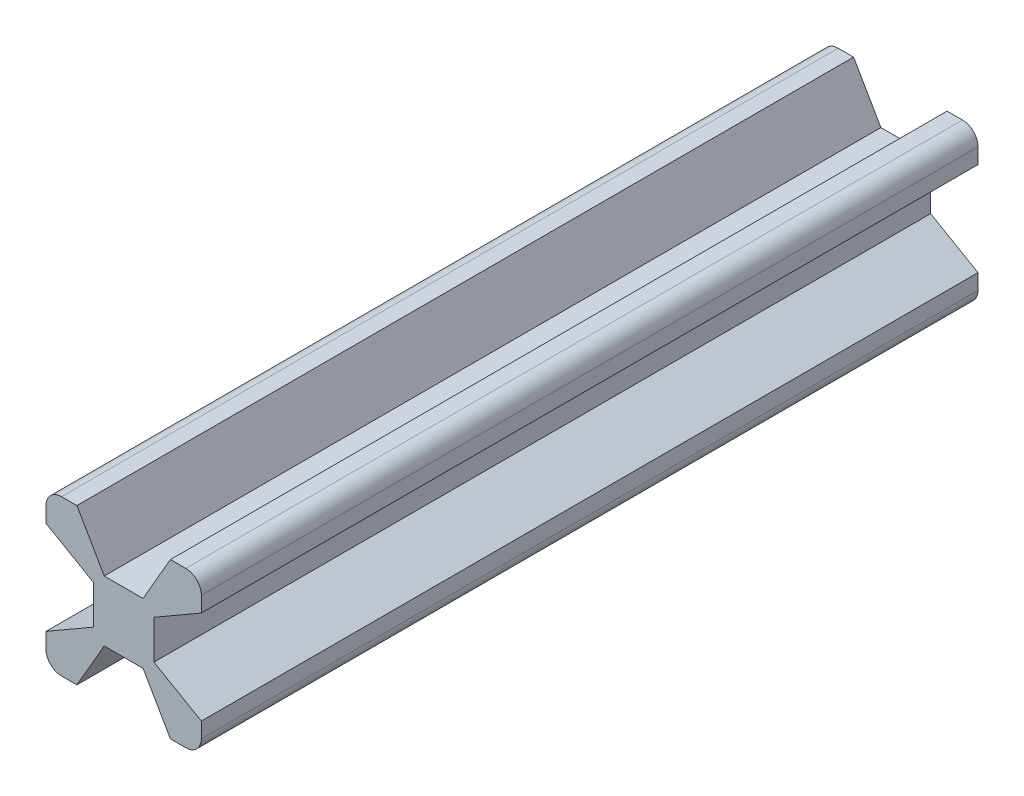
ISO-10303-21;
HEADER;
FILE_DESCRIPTION(('STEP AP214'),'2;1');
FILE_NAME('part.step','',(''),(''),'','','');
FILE_SCHEMA(('AUTOMOTIVE_DESIGN { 1 0 10303 214 1 1 1 1 }'));
ENDSEC;
DATA;
#1=APPLICATION_CONTEXT('core data for automotive mechanical design processes');
#2=APPLICATION_PROTOCOL_DEFINITION('international standard','automotive_design',2000,#1);
#3=PRODUCT_CONTEXT('',#1,'mechanical');
#4=PRODUCT('Part','Part','',(#3));
#5=PRODUCT_RELATED_PRODUCT_CATEGORY('part','',(#4));
#6=PRODUCT_DEFINITION_FORMATION('','',#4);
#7=PRODUCT_DEFINITION_CONTEXT('part definition',#1,'design');
#8=PRODUCT_DEFINITION('design','',#6,#7);
#9=PRODUCT_DEFINITION_SHAPE('','',#8);
#10=(LENGTH_UNIT() NAMED_UNIT(*) SI_UNIT(.MILLI.,.METRE.));
#11=(NAMED_UNIT(*) PLANE_ANGLE_UNIT() SI_UNIT($,.RADIAN.));
#12=(NAMED_UNIT(*) SI_UNIT($,.STERADIAN.) SOLID_ANGLE_UNIT());
#13=UNCERTAINTY_MEASURE_WITH_UNIT(LENGTH_MEASURE(1.E-05),#10,'distance_accuracy_value','');
#14=(GEOMETRIC_REPRESENTATION_CONTEXT(3) GLOBAL_UNCERTAINTY_ASSIGNED_CONTEXT((#13)) GLOBAL_UNIT_ASSIGNED_CONTEXT((#10,
#11,#12)) REPRESENTATION_CONTEXT('',''));
#15=CARTESIAN_POINT('',(0.,0.,0.));
#16=DIRECTION('',(0.,0.,1.));
#17=DIRECTION('',(1.,0.,0.));
#18=AXIS2_PLACEMENT_3D('',#15,#16,#17);
#19=CARTESIAN_POINT('',(-10.,-10.,100.));
#20=DIRECTION('',(1.,0.,0.));
#21=DIRECTION('',(0.,0.,-1.));
#22=AXIS2_PLACEMENT_3D('',#19,#20,#21);
#23=PLANE('',#22);
#24=DIRECTION('',(0.,-1.,0.));
#25=VECTOR('',#24,1.);
#26=CARTESIAN_POINT('',(-10.,-10.,100.));
#27=LINE('',#26,#25);
#28=CARTESIAN_POINT('',(-10.,8.,100.));
#29=VERTEX_POINT('',#28);
#30=CARTESIAN_POINT('',(-10.,6.02183664205666,100.));
#31=VERTEX_POINT('',#30);
#32=EDGE_CURVE('E318',#29,#31,#27,.T.);
#33=ORIENTED_EDGE('',*,*,#32,.F.);
#34=DIRECTION('',(0.,0.,-1.));
#35=VECTOR('',#34,1.);
#36=CARTESIAN_POINT('',(-10.,8.,100.));
#37=LINE('',#36,#35);
#38=CARTESIAN_POINT('',(-10.,8.,0.));
#39=VERTEX_POINT('',#38);
#40=EDGE_CURVE('E50',#29,#39,#37,.T.);
#41=ORIENTED_EDGE('',*,*,#40,.T.);
#42=DIRECTION('',(0.,-1.,0.));
#43=VECTOR('',#42,1.);
#44=CARTESIAN_POINT('',(-10.,-10.,0.));
#45=LINE('',#44,#43);
#46=CARTESIAN_POINT('',(-10.,6.02183664205666,0.));
#47=VERTEX_POINT('',#46);
#48=EDGE_CURVE('E330',#39,#47,#45,.T.);
#49=ORIENTED_EDGE('',*,*,#48,.T.);
#50=DIRECTION('',(0.,0.,-1.));
#51=VECTOR('',#50,1.);
#52=CARTESIAN_POINT('',(-10.,6.02183664205666,100.));
#53=LINE('',#52,#51);
#54=EDGE_CURVE('E290',#31,#47,#53,.T.);
#55=ORIENTED_EDGE('',*,*,#54,.F.);
#56=EDGE_LOOP('',(#33,#41,#49,#55));
#57=FACE_BOUND('',#56,.T.);
#58=ADVANCED_FACE('F39',(#57),#23,.F.);
#59=CARTESIAN_POINT('',(10.,-10.,100.));
#60=DIRECTION('',(0.,1.,0.));
#61=DIRECTION('',(-1.,0.,0.));
#62=AXIS2_PLACEMENT_3D('',#59,#60,#61);
#63=PLANE('',#62);
#64=DIRECTION('',(1.,0.,0.));
#65=VECTOR('',#64,1.);
#66=CARTESIAN_POINT('',(10.,-10.,100.));
#67=LINE('',#66,#65);
#68=CARTESIAN_POINT('',(-8.,-10.,100.));
#69=VERTEX_POINT('',#68);
#70=CARTESIAN_POINT('',(-6.0218366420567,-10.,100.));
#71=VERTEX_POINT('',#70);
#72=EDGE_CURVE('E325',#69,#71,#67,.T.);
#73=ORIENTED_EDGE('',*,*,#72,.F.);
#74=DIRECTION('',(0.,0.,-1.));
#75=VECTOR('',#74,1.);
#76=CARTESIAN_POINT('',(-8.,-10.,100.));
#77=LINE('',#76,#75);
#78=CARTESIAN_POINT('',(-8.,-10.,0.));
#79=VERTEX_POINT('',#78);
#80=EDGE_CURVE('E326',#69,#79,#77,.T.);
#81=ORIENTED_EDGE('',*,*,#80,.T.);
#82=DIRECTION('',(1.,0.,0.));
#83=VECTOR('',#82,1.);
#84=CARTESIAN_POINT('',(10.,-10.,0.));
#85=LINE('',#84,#83);
#86=CARTESIAN_POINT('',(-6.0218366420567,-10.,0.));
#87=VERTEX_POINT('',#86);
#88=EDGE_CURVE('E329',#79,#87,#85,.T.);
#89=ORIENTED_EDGE('',*,*,#88,.T.);
#90=DIRECTION('',(0.,0.,-1.));
#91=VECTOR('',#90,1.);
#92=CARTESIAN_POINT('',(-6.0218366420567,-10.,100.));
#93=LINE('',#92,#91);
#94=EDGE_CURVE('E257',#71,#87,#93,.T.);
#95=ORIENTED_EDGE('',*,*,#94,.F.);
#96=EDGE_LOOP('',(#73,#81,#89,#95));
#97=FACE_BOUND('',#96,.T.);
#98=ADVANCED_FACE('F399',(#97),#63,.F.);
#99=CARTESIAN_POINT('',(10.,-10.,100.));
#100=DIRECTION('',(-1.,0.,0.));
#101=DIRECTION('',(0.,0.,1.));
#102=AXIS2_PLACEMENT_3D('',#99,#100,#101);
#103=PLANE('',#102);
#104=DIRECTION('',(0.,1.,0.));
#105=VECTOR('',#104,1.);
#106=CARTESIAN_POINT('',(10.,-10.,100.));
#107=LINE('',#106,#105);
#108=CARTESIAN_POINT('',(10.,-8.,100.));
#109=VERTEX_POINT('',#108);
#110=CARTESIAN_POINT('',(10.0000000000001,-6.02183664205659,100.));
#111=VERTEX_POINT('',#110);
#112=EDGE_CURVE('E200',#109,#111,#107,.T.);
#113=ORIENTED_EDGE('',*,*,#112,.F.);
#114=DIRECTION('',(0.,0.,-1.));
#115=VECTOR('',#114,1.);
#116=CARTESIAN_POINT('',(10.,-8.,100.));
#117=LINE('',#116,#115);
#118=CARTESIAN_POINT('',(10.,-8.,0.));
#119=VERTEX_POINT('',#118);
#120=EDGE_CURVE('E354',#109,#119,#117,.T.);
#121=ORIENTED_EDGE('',*,*,#120,.T.);
#122=DIRECTION('',(0.,1.,0.));
#123=VECTOR('',#122,1.);
#124=CARTESIAN_POINT('',(10.,-10.,0.));
#125=LINE('',#124,#123);
#126=CARTESIAN_POINT('',(10.0000000000001,-6.02183664205659,0.));
#127=VERTEX_POINT('',#126);
#128=EDGE_CURVE('E227',#119,#127,#125,.T.);
#129=ORIENTED_EDGE('',*,*,#128,.T.);
#130=DIRECTION('',(0.,0.,-1.));
#131=VECTOR('',#130,1.);
#132=CARTESIAN_POINT('',(10.0000000000001,-6.02183664205659,100.));
#133=LINE('',#132,#131);
#134=EDGE_CURVE('E218',#111,#127,#133,.T.);
#135=ORIENTED_EDGE('',*,*,#134,.F.);
#136=EDGE_LOOP('',(#113,#121,#129,#135));
#137=FACE_BOUND('',#136,.T.);
#138=ADVANCED_FACE('F226',(#137),#103,.F.);
#139=CARTESIAN_POINT('',(10.,10.,100.));
#140=DIRECTION('',(0.,-1.,0.));
#141=DIRECTION('',(1.,0.,0.));
#142=AXIS2_PLACEMENT_3D('',#139,#140,#141);
#143=PLANE('',#142);
#144=DIRECTION('',(-1.,0.,0.));
#145=VECTOR('',#144,1.);
#146=CARTESIAN_POINT('',(10.,10.,100.));
#147=LINE('',#146,#145);
#148=CARTESIAN_POINT('',(8.,10.,100.));
#149=VERTEX_POINT('',#148);
#150=CARTESIAN_POINT('',(6.0218366420567,10.,100.));
#151=VERTEX_POINT('',#150);
#152=EDGE_CURVE('E322',#149,#151,#147,.T.);
#153=ORIENTED_EDGE('',*,*,#152,.F.);
#154=DIRECTION('',(0.,0.,-1.));
#155=VECTOR('',#154,1.);
#156=CARTESIAN_POINT('',(8.,10.,100.));
#157=LINE('',#156,#155);
#158=CARTESIAN_POINT('',(8.,10.,0.));
#159=VERTEX_POINT('',#158);
#160=EDGE_CURVE('E356',#149,#159,#157,.T.);
#161=ORIENTED_EDGE('',*,*,#160,.T.);
#162=DIRECTION('',(-1.,0.,0.));
#163=VECTOR('',#162,1.);
#164=CARTESIAN_POINT('',(10.,10.,0.));
#165=LINE('',#164,#163);
#166=CARTESIAN_POINT('',(6.0218366420567,10.,0.));
#167=VERTEX_POINT('',#166);
#168=EDGE_CURVE('E333',#159,#167,#165,.T.);
#169=ORIENTED_EDGE('',*,*,#168,.T.);
#170=DIRECTION('',(0.,0.,-1.));
#171=VECTOR('',#170,1.);
#172=CARTESIAN_POINT('',(6.0218366420567,10.,100.));
#173=LINE('',#172,#171);
#174=EDGE_CURVE('E314',#151,#167,#173,.T.);
#175=ORIENTED_EDGE('',*,*,#174,.F.);
#176=EDGE_LOOP('',(#153,#161,#169,#175));
#177=FACE_BOUND('',#176,.T.);
#178=ADVANCED_FACE('F452',(#177),#143,.F.);
#179=CARTESIAN_POINT('',(-9.99999999999998,-6.02183664205673,0.));
#180=VERTEX_POINT('',#179);
#181=CARTESIAN_POINT('',(-10.,-8.,0.));
#182=VERTEX_POINT('',#181);
#183=EDGE_CURVE('E320',#180,#182,#45,.T.);
#184=ORIENTED_EDGE('',*,*,#183,.T.);
#185=DIRECTION('',(0.,0.,-1.));
#186=VECTOR('',#185,1.);
#187=CARTESIAN_POINT('',(-10.,-8.,100.));
#188=LINE('',#187,#186);
#189=CARTESIAN_POINT('',(-10.,-8.,100.));
#190=VERTEX_POINT('',#189);
#191=EDGE_CURVE('E350',#182,#190,#188,.F.);
#192=ORIENTED_EDGE('',*,*,#191,.T.);
#193=CARTESIAN_POINT('',(-9.99999999999998,-6.02183664205673,100.));
#194=VERTEX_POINT('',#193);
#195=EDGE_CURVE('E321',#194,#190,#27,.T.);
#196=ORIENTED_EDGE('',*,*,#195,.F.);
#197=DIRECTION('',(0.,0.,-1.));
#198=VECTOR('',#197,1.);
#199=CARTESIAN_POINT('',(-9.99999999999998,-6.02183664205673,100.));
#200=LINE('',#199,#198);
#201=EDGE_CURVE('E283',#194,#180,#200,.T.);
#202=ORIENTED_EDGE('',*,*,#201,.T.);
#203=EDGE_LOOP('',(#184,#192,#196,#202));
#204=FACE_BOUND('',#203,.T.);
#205=ADVANCED_FACE('F389',(#204),#23,.F.);
#206=CARTESIAN_POINT('',(6.0218366420567,-10.,0.));
#207=VERTEX_POINT('',#206);
#208=CARTESIAN_POINT('',(8.,-10.,0.));
#209=VERTEX_POINT('',#208);
#210=EDGE_CURVE('E328',#207,#209,#85,.T.);
#211=ORIENTED_EDGE('',*,*,#210,.T.);
#212=DIRECTION('',(0.,0.,-1.));
#213=VECTOR('',#212,1.);
#214=CARTESIAN_POINT('',(8.,-10.,100.));
#215=LINE('',#214,#213);
#216=CARTESIAN_POINT('',(8.,-10.,100.));
#217=VERTEX_POINT('',#216);
#218=EDGE_CURVE('E360',#209,#217,#215,.F.);
#219=ORIENTED_EDGE('',*,*,#218,.T.);
#220=CARTESIAN_POINT('',(6.0218366420567,-10.,100.));
#221=VERTEX_POINT('',#220);
#222=EDGE_CURVE('E319',#221,#217,#67,.T.);
#223=ORIENTED_EDGE('',*,*,#222,.F.);
#224=DIRECTION('',(0.,0.,-1.));
#225=VECTOR('',#224,1.);
#226=CARTESIAN_POINT('',(6.0218366420567,-10.,100.));
#227=LINE('',#226,#225);
#228=EDGE_CURVE('E260',#221,#207,#227,.T.);
#229=ORIENTED_EDGE('',*,*,#228,.T.);
#230=EDGE_LOOP('',(#211,#219,#223,#229));
#231=FACE_BOUND('',#230,.T.);
#232=ADVANCED_FACE('F414',(#231),#63,.F.);
#233=CARTESIAN_POINT('',(9.99999999999994,6.0218366420568,0.));
#234=VERTEX_POINT('',#233);
#235=CARTESIAN_POINT('',(10.,8.,0.));
#236=VERTEX_POINT('',#235);
#237=EDGE_CURVE('E335',#234,#236,#125,.T.);
#238=ORIENTED_EDGE('',*,*,#237,.T.);
#239=DIRECTION('',(0.,0.,-1.));
#240=VECTOR('',#239,1.);
#241=CARTESIAN_POINT('',(10.,8.,100.));
#242=LINE('',#241,#240);
#243=CARTESIAN_POINT('',(10.,8.,100.));
#244=VERTEX_POINT('',#243);
#245=EDGE_CURVE('E362',#236,#244,#242,.F.);
#246=ORIENTED_EDGE('',*,*,#245,.T.);
#247=CARTESIAN_POINT('',(9.99999999999994,6.0218366420568,100.));
#248=VERTEX_POINT('',#247);
#249=EDGE_CURVE('E213',#248,#244,#107,.T.);
#250=ORIENTED_EDGE('',*,*,#249,.F.);
#251=DIRECTION('',(0.,0.,-1.));
#252=VECTOR('',#251,1.);
#253=CARTESIAN_POINT('',(9.99999999999994,6.0218366420568,100.));
#254=LINE('',#253,#252);
#255=EDGE_CURVE('E229',#248,#234,#254,.T.);
#256=ORIENTED_EDGE('',*,*,#255,.T.);
#257=EDGE_LOOP('',(#238,#246,#250,#256));
#258=FACE_BOUND('',#257,.T.);
#259=ADVANCED_FACE('F439',(#258),#103,.F.);
#260=CARTESIAN_POINT('',(-6.0218366420567,10.,0.));
#261=VERTEX_POINT('',#260);
#262=CARTESIAN_POINT('',(-8.,10.,0.));
#263=VERTEX_POINT('',#262);
#264=EDGE_CURVE('E331',#261,#263,#165,.T.);
#265=ORIENTED_EDGE('',*,*,#264,.T.);
#266=DIRECTION('',(0.,0.,-1.));
#267=VECTOR('',#266,1.);
#268=CARTESIAN_POINT('',(-8.,10.,100.));
#269=LINE('',#268,#267);
#270=CARTESIAN_POINT('',(-8.,10.,100.));
#271=VERTEX_POINT('',#270);
#272=EDGE_CURVE('E11',#263,#271,#269,.F.);
#273=ORIENTED_EDGE('',*,*,#272,.T.);
#274=CARTESIAN_POINT('',(-6.0218366420567,10.,100.));
#275=VERTEX_POINT('',#274);
#276=EDGE_CURVE('E215',#275,#271,#147,.T.);
#277=ORIENTED_EDGE('',*,*,#276,.F.);
#278=DIRECTION('',(0.,0.,-1.));
#279=VECTOR('',#278,1.);
#280=CARTESIAN_POINT('',(-6.0218366420567,10.,100.));
#281=LINE('',#280,#279);
#282=EDGE_CURVE('E313',#275,#261,#281,.T.);
#283=ORIENTED_EDGE('',*,*,#282,.T.);
#284=EDGE_LOOP('',(#265,#273,#277,#283));
#285=FACE_BOUND('',#284,.T.);
#286=ADVANCED_FACE('F465',(#285),#143,.F.);
#287=CARTESIAN_POINT('',(0.,0.,100.));
#288=DIRECTION('',(0.,0.,1.));
#289=DIRECTION('',(1.,0.,0.));
#290=AXIS2_PLACEMENT_3D('',#287,#288,#289);
#291=PLANE('',#290);
#292=ORIENTED_EDGE('',*,*,#195,.T.);
#293=CARTESIAN_POINT('',(-8.,-8.,100.));
#294=DIRECTION('',(0.,0.,1.));
#295=DIRECTION('',(1.,0.,0.));
#296=AXIS2_PLACEMENT_3D('',#293,#294,#295);
#297=CIRCLE('',#296,2.);
#298=EDGE_CURVE('E352',#190,#69,#297,.T.);
#299=ORIENTED_EDGE('',*,*,#298,.T.);
#300=ORIENTED_EDGE('',*,*,#72,.T.);
#301=DIRECTION('',(-0.499999999999998,-0.86602540378444,0.));
#302=VECTOR('',#301,1.);
#303=CARTESIAN_POINT('',(-0.186250462620355,0.107531754730554,100.));
#304=LINE('',#303,#302);
#305=CARTESIAN_POINT('',(-2.5,-3.9,100.));
#306=VERTEX_POINT('',#305);
#307=EDGE_CURVE('E238',#306,#71,#304,.T.);
#308=ORIENTED_EDGE('',*,*,#307,.F.);
#309=DIRECTION('',(-1.,0.,0.));
#310=VECTOR('',#309,1.);
#311=CARTESIAN_POINT('',(0.,-3.9,100.));
#312=LINE('',#311,#310);
#313=CARTESIAN_POINT('',(2.5,-3.9,100.));
#314=VERTEX_POINT('',#313);
#315=EDGE_CURVE('E247',#314,#306,#312,.T.);
#316=ORIENTED_EDGE('',*,*,#315,.F.);
#317=DIRECTION('',(-0.499999999999998,0.86602540378444,0.));
#318=VECTOR('',#317,1.);
#319=CARTESIAN_POINT('',(0.186250462620354,0.107531754730553,100.));
#320=LINE('',#319,#318);
#321=EDGE_CURVE('E242',#221,#314,#320,.T.);
#322=ORIENTED_EDGE('',*,*,#321,.F.);
#323=ORIENTED_EDGE('',*,*,#222,.T.);
#324=CARTESIAN_POINT('',(8.,-8.,100.));
#325=DIRECTION('',(0.,0.,1.));
#326=DIRECTION('',(1.,0.,0.));
#327=AXIS2_PLACEMENT_3D('',#324,#325,#326);
#328=CIRCLE('',#327,2.);
#329=EDGE_CURVE('E210',#217,#109,#328,.T.);
#330=ORIENTED_EDGE('',*,*,#329,.T.);
#331=ORIENTED_EDGE('',*,*,#112,.T.);
#332=DIRECTION('',(0.866025403784445,-0.499999999999989,0.));
#333=VECTOR('',#332,1.);
#334=CARTESIAN_POINT('',(-0.107531754730552,-0.186250462620356,100.));
#335=LINE('',#334,#333);
#336=CARTESIAN_POINT('',(3.90000000000002,-2.49999999999996,100.));
#337=VERTEX_POINT('',#336);
#338=EDGE_CURVE('E204',#337,#111,#335,.T.);
#339=ORIENTED_EDGE('',*,*,#338,.F.);
#340=DIRECTION('',(0.,-1.,0.));
#341=VECTOR('',#340,1.);
#342=CARTESIAN_POINT('',(3.9,0.,100.));
#343=LINE('',#342,#341);
#344=CARTESIAN_POINT('',(3.89999999999997,2.50000000000004,100.));
#345=VERTEX_POINT('',#344);
#346=EDGE_CURVE('E422',#345,#337,#343,.T.);
#347=ORIENTED_EDGE('',*,*,#346,.F.);
#348=DIRECTION('',(-0.866025403784435,-0.500000000000007,0.));
#349=VECTOR('',#348,1.);
#350=CARTESIAN_POINT('',(-0.107531754730555,0.186250462620353,100.));
#351=LINE('',#350,#349);
#352=EDGE_CURVE('E224',#248,#345,#351,.T.);
#353=ORIENTED_EDGE('',*,*,#352,.F.);
#354=ORIENTED_EDGE('',*,*,#249,.T.);
#355=CARTESIAN_POINT('',(8.,8.,100.));
#356=DIRECTION('',(0.,0.,1.));
#357=DIRECTION('',(1.,0.,0.));
#358=AXIS2_PLACEMENT_3D('',#355,#356,#357);
#359=CIRCLE('',#358,2.);
#360=EDGE_CURVE('E348',#244,#149,#359,.T.);
#361=ORIENTED_EDGE('',*,*,#360,.T.);
#362=ORIENTED_EDGE('',*,*,#152,.T.);
#363=DIRECTION('',(0.499999999999998,0.86602540378444,0.));
#364=VECTOR('',#363,1.);
#365=CARTESIAN_POINT('',(0.186250462620355,-0.107531754730554,100.));
#366=LINE('',#365,#364);
#367=CARTESIAN_POINT('',(2.5,3.9,100.));
#368=VERTEX_POINT('',#367);
#369=EDGE_CURVE('E292',#368,#151,#366,.T.);
#370=ORIENTED_EDGE('',*,*,#369,.F.);
#371=DIRECTION('',(1.,0.,0.));
#372=VECTOR('',#371,1.);
#373=CARTESIAN_POINT('',(0.,3.9,100.));
#374=LINE('',#373,#372);
#375=CARTESIAN_POINT('',(-2.5,3.9,100.));
#376=VERTEX_POINT('',#375);
#377=EDGE_CURVE('E300',#376,#368,#374,.T.);
#378=ORIENTED_EDGE('',*,*,#377,.F.);
#379=DIRECTION('',(0.499999999999998,-0.86602540378444,0.));
#380=VECTOR('',#379,1.);
#381=CARTESIAN_POINT('',(-0.186250462620354,-0.107531754730553,100.));
#382=LINE('',#381,#380);
#383=EDGE_CURVE('E294',#275,#376,#382,.T.);
#384=ORIENTED_EDGE('',*,*,#383,.F.);
#385=ORIENTED_EDGE('',*,*,#276,.T.);
#386=CARTESIAN_POINT('',(-8.,8.,100.));
#387=DIRECTION('',(0.,0.,1.));
#388=DIRECTION('',(1.,0.,0.));
#389=AXIS2_PLACEMENT_3D('',#386,#387,#388);
#390=CIRCLE('',#389,2.);
#391=EDGE_CURVE('E53',#271,#29,#390,.T.);
#392=ORIENTED_EDGE('',*,*,#391,.T.);
#393=ORIENTED_EDGE('',*,*,#32,.T.);
#394=DIRECTION('',(-0.866025403784442,0.499999999999995,0.));
#395=VECTOR('',#394,1.);
#396=CARTESIAN_POINT('',(0.107531754730553,0.186250462620355,100.));
#397=LINE('',#396,#395);
#398=CARTESIAN_POINT('',(-3.90000000000001,2.49999999999999,100.));
#399=VERTEX_POINT('',#398);
#400=EDGE_CURVE('E262',#399,#31,#397,.T.);
#401=ORIENTED_EDGE('',*,*,#400,.F.);
#402=DIRECTION('',(0.,1.,0.));
#403=VECTOR('',#402,1.);
#404=CARTESIAN_POINT('',(-3.9,0.,100.));
#405=LINE('',#404,#403);
#406=CARTESIAN_POINT('',(-3.89999999999999,-2.50000000000001,100.));
#407=VERTEX_POINT('',#406);
#408=EDGE_CURVE('E269',#407,#399,#405,.T.);
#409=ORIENTED_EDGE('',*,*,#408,.F.);
#410=DIRECTION('',(0.866025403784438,0.500000000000001,0.));
#411=VECTOR('',#410,1.);
#412=CARTESIAN_POINT('',(0.107531754730554,-0.186250462620354,100.));
#413=LINE('',#412,#411);
#414=EDGE_CURVE('E270',#194,#407,#413,.T.);
#415=ORIENTED_EDGE('',*,*,#414,.F.);
#416=EDGE_LOOP('',(#292,#299,#300,#308,#316,#322,#323,#330,#331,#339,#347,#353,#354,#361,#362,
#370,#378,#384,#385,#392,#393,#401,#409,#415));
#417=FACE_BOUND('',#416,.T.);
#418=ADVANCED_FACE('F205',(#417),#291,.T.);
#419=CARTESIAN_POINT('',(0.,0.,0.));
#420=DIRECTION('',(0.,0.,1.));
#421=DIRECTION('',(1.,0.,0.));
#422=AXIS2_PLACEMENT_3D('',#419,#420,#421);
#423=PLANE('',#422);
#424=ORIENTED_EDGE('',*,*,#88,.F.);
#425=CARTESIAN_POINT('',(-8.,-8.,0.));
#426=DIRECTION('',(0.,0.,1.));
#427=DIRECTION('',(1.,0.,0.));
#428=AXIS2_PLACEMENT_3D('',#425,#426,#427);
#429=CIRCLE('',#428,2.);
#430=EDGE_CURVE('E343',#79,#182,#429,.F.);
#431=ORIENTED_EDGE('',*,*,#430,.T.);
#432=ORIENTED_EDGE('',*,*,#183,.F.);
#433=DIRECTION('',(0.866025403784438,0.500000000000001,0.));
#434=VECTOR('',#433,1.);
#435=CARTESIAN_POINT('',(0.107531754730554,-0.186250462620354,0.));
#436=LINE('',#435,#434);
#437=CARTESIAN_POINT('',(-3.89999999999999,-2.50000000000001,0.));
#438=VERTEX_POINT('',#437);
#439=EDGE_CURVE('E274',#180,#438,#436,.T.);
#440=ORIENTED_EDGE('',*,*,#439,.T.);
#441=DIRECTION('',(0.,1.,0.));
#442=VECTOR('',#441,1.);
#443=CARTESIAN_POINT('',(-3.9,0.,0.));
#444=LINE('',#443,#442);
#445=CARTESIAN_POINT('',(-3.90000000000001,2.49999999999999,0.));
#446=VERTEX_POINT('',#445);
#447=EDGE_CURVE('E268',#438,#446,#444,.T.);
#448=ORIENTED_EDGE('',*,*,#447,.T.);
#449=DIRECTION('',(-0.866025403784442,0.499999999999995,0.));
#450=VECTOR('',#449,1.);
#451=CARTESIAN_POINT('',(0.107531754730553,0.186250462620355,0.));
#452=LINE('',#451,#450);
#453=EDGE_CURVE('E263',#446,#47,#452,.T.);
#454=ORIENTED_EDGE('',*,*,#453,.T.);
#455=ORIENTED_EDGE('',*,*,#48,.F.);
#456=CARTESIAN_POINT('',(-8.,8.,0.));
#457=DIRECTION('',(0.,0.,1.));
#458=DIRECTION('',(1.,0.,0.));
#459=AXIS2_PLACEMENT_3D('',#456,#457,#458);
#460=CIRCLE('',#459,2.);
#461=EDGE_CURVE('E338',#39,#263,#460,.F.);
#462=ORIENTED_EDGE('',*,*,#461,.T.);
#463=ORIENTED_EDGE('',*,*,#264,.F.);
#464=DIRECTION('',(0.499999999999998,-0.86602540378444,0.));
#465=VECTOR('',#464,1.);
#466=CARTESIAN_POINT('',(-0.186250462620354,-0.107531754730553,0.));
#467=LINE('',#466,#465);
#468=CARTESIAN_POINT('',(-2.5,3.9,0.));
#469=VERTEX_POINT('',#468);
#470=EDGE_CURVE('E305',#261,#469,#467,.T.);
#471=ORIENTED_EDGE('',*,*,#470,.T.);
#472=DIRECTION('',(1.,0.,0.));
#473=VECTOR('',#472,1.);
#474=CARTESIAN_POINT('',(0.,3.9,0.));
#475=LINE('',#474,#473);
#476=CARTESIAN_POINT('',(2.5,3.9,0.));
#477=VERTEX_POINT('',#476);
#478=EDGE_CURVE('E293',#469,#477,#475,.T.);
#479=ORIENTED_EDGE('',*,*,#478,.T.);
#480=DIRECTION('',(0.499999999999998,0.86602540378444,0.));
#481=VECTOR('',#480,1.);
#482=CARTESIAN_POINT('',(0.186250462620355,-0.107531754730554,0.));
#483=LINE('',#482,#481);
#484=EDGE_CURVE('E288',#477,#167,#483,.T.);
#485=ORIENTED_EDGE('',*,*,#484,.T.);
#486=ORIENTED_EDGE('',*,*,#168,.F.);
#487=CARTESIAN_POINT('',(8.,8.,0.));
#488=DIRECTION('',(0.,0.,1.));
#489=DIRECTION('',(1.,0.,0.));
#490=AXIS2_PLACEMENT_3D('',#487,#488,#489);
#491=CIRCLE('',#490,2.);
#492=EDGE_CURVE('E342',#159,#236,#491,.F.);
#493=ORIENTED_EDGE('',*,*,#492,.T.);
#494=ORIENTED_EDGE('',*,*,#237,.F.);
#495=DIRECTION('',(-0.866025403784435,-0.500000000000007,0.));
#496=VECTOR('',#495,1.);
#497=CARTESIAN_POINT('',(-0.107531754730555,0.186250462620353,0.));
#498=LINE('',#497,#496);
#499=CARTESIAN_POINT('',(3.89999999999997,2.50000000000004,0.));
#500=VERTEX_POINT('',#499);
#501=EDGE_CURVE('E423',#234,#500,#498,.T.);
#502=ORIENTED_EDGE('',*,*,#501,.T.);
#503=DIRECTION('',(0.,-1.,0.));
#504=VECTOR('',#503,1.);
#505=CARTESIAN_POINT('',(3.9,0.,0.));
#506=LINE('',#505,#504);
#507=CARTESIAN_POINT('',(3.90000000000002,-2.49999999999996,0.));
#508=VERTEX_POINT('',#507);
#509=EDGE_CURVE('E221',#500,#508,#506,.T.);
#510=ORIENTED_EDGE('',*,*,#509,.T.);
#511=DIRECTION('',(0.866025403784445,-0.499999999999989,0.));
#512=VECTOR('',#511,1.);
#513=CARTESIAN_POINT('',(-0.107531754730552,-0.186250462620356,0.));
#514=LINE('',#513,#512);
#515=EDGE_CURVE('E416',#508,#127,#514,.T.);
#516=ORIENTED_EDGE('',*,*,#515,.T.);
#517=ORIENTED_EDGE('',*,*,#128,.F.);
#518=CARTESIAN_POINT('',(8.,-8.,0.));
#519=DIRECTION('',(0.,0.,1.));
#520=DIRECTION('',(1.,0.,0.));
#521=AXIS2_PLACEMENT_3D('',#518,#519,#520);
#522=CIRCLE('',#521,2.);
#523=EDGE_CURVE('E344',#119,#209,#522,.F.);
#524=ORIENTED_EDGE('',*,*,#523,.T.);
#525=ORIENTED_EDGE('',*,*,#210,.F.);
#526=DIRECTION('',(-0.499999999999998,0.86602540378444,0.));
#527=VECTOR('',#526,1.);
#528=CARTESIAN_POINT('',(0.186250462620354,0.107531754730553,0.));
#529=LINE('',#528,#527);
#530=CARTESIAN_POINT('',(2.5,-3.9,0.));
#531=VERTEX_POINT('',#530);
#532=EDGE_CURVE('E234',#207,#531,#529,.T.);
#533=ORIENTED_EDGE('',*,*,#532,.T.);
#534=DIRECTION('',(-1.,0.,0.));
#535=VECTOR('',#534,1.);
#536=CARTESIAN_POINT('',(0.,-3.9,0.));
#537=LINE('',#536,#535);
#538=CARTESIAN_POINT('',(-2.5,-3.9,0.));
#539=VERTEX_POINT('',#538);
#540=EDGE_CURVE('E243',#531,#539,#537,.T.);
#541=ORIENTED_EDGE('',*,*,#540,.T.);
#542=DIRECTION('',(-0.499999999999998,-0.86602540378444,0.));
#543=VECTOR('',#542,1.);
#544=CARTESIAN_POINT('',(-0.186250462620355,0.107531754730554,0.));
#545=LINE('',#544,#543);
#546=EDGE_CURVE('E228',#539,#87,#545,.T.);
#547=ORIENTED_EDGE('',*,*,#546,.T.);
#548=EDGE_LOOP('',(#424,#431,#432,#440,#448,#454,#455,#462,#463,#471,#479,#485,#486,#493,#494,
#502,#510,#516,#517,#524,#525,#533,#541,#547));
#549=FACE_BOUND('',#548,.T.);
#550=ADVANCED_FACE('F371',(#549),#423,.F.);
#551=CARTESIAN_POINT('',(0.186250462620355,-0.107531754730554,100.));
#552=DIRECTION('',(-0.86602540378444,0.499999999999998,0.));
#553=DIRECTION('',(-0.499999999999998,-0.86602540378444,0.));
#554=AXIS2_PLACEMENT_3D('',#551,#552,#553);
#555=PLANE('',#554);
#556=ORIENTED_EDGE('',*,*,#484,.F.);
#557=DIRECTION('',(0.,0.,-1.));
#558=VECTOR('',#557,1.);
#559=CARTESIAN_POINT('',(2.5,3.9,100.));
#560=LINE('',#559,#558);
#561=EDGE_CURVE('E298',#368,#477,#560,.T.);
#562=ORIENTED_EDGE('',*,*,#561,.F.);
#563=ORIENTED_EDGE('',*,*,#369,.T.);
#564=ORIENTED_EDGE('',*,*,#174,.T.);
#565=EDGE_LOOP('',(#556,#562,#563,#564));
#566=FACE_BOUND('',#565,.T.);
#567=ADVANCED_FACE('F454',(#566),#555,.T.);
#568=CARTESIAN_POINT('',(-0.186250462620354,-0.107531754730553,100.));
#569=DIRECTION('',(0.86602540378444,0.499999999999998,0.));
#570=DIRECTION('',(-0.499999999999998,0.86602540378444,0.));
#571=AXIS2_PLACEMENT_3D('',#568,#569,#570);
#572=PLANE('',#571);
#573=ORIENTED_EDGE('',*,*,#470,.F.);
#574=ORIENTED_EDGE('',*,*,#282,.F.);
#575=ORIENTED_EDGE('',*,*,#383,.T.);
#576=DIRECTION('',(0.,0.,-1.));
#577=VECTOR('',#576,1.);
#578=CARTESIAN_POINT('',(-2.5,3.9,100.));
#579=LINE('',#578,#577);
#580=EDGE_CURVE('E310',#376,#469,#579,.T.);
#581=ORIENTED_EDGE('',*,*,#580,.T.);
#582=EDGE_LOOP('',(#573,#574,#575,#581));
#583=FACE_BOUND('',#582,.T.);
#584=ADVANCED_FACE('F462',(#583),#572,.T.);
#585=CARTESIAN_POINT('',(0.,3.9,100.));
#586=DIRECTION('',(0.,1.,0.));
#587=DIRECTION('',(0.,0.,1.));
#588=AXIS2_PLACEMENT_3D('',#585,#586,#587);
#589=PLANE('',#588);
#590=ORIENTED_EDGE('',*,*,#478,.F.);
#591=ORIENTED_EDGE('',*,*,#580,.F.);
#592=ORIENTED_EDGE('',*,*,#377,.T.);
#593=ORIENTED_EDGE('',*,*,#561,.T.);
#594=EDGE_LOOP('',(#590,#591,#592,#593));
#595=FACE_BOUND('',#594,.T.);
#596=ADVANCED_FACE('F456',(#595),#589,.T.);
#597=CARTESIAN_POINT('',(0.107531754730553,0.186250462620355,100.));
#598=DIRECTION('',(-0.499999999999995,-0.866025403784442,0.));
#599=DIRECTION('',(0.866025403784442,-0.499999999999995,0.));
#600=AXIS2_PLACEMENT_3D('',#597,#598,#599);
#601=PLANE('',#600);
#602=ORIENTED_EDGE('',*,*,#453,.F.);
#603=DIRECTION('',(0.,0.,-1.));
#604=VECTOR('',#603,1.);
#605=CARTESIAN_POINT('',(-3.90000000000001,2.49999999999999,100.));
#606=LINE('',#605,#604);
#607=EDGE_CURVE('E275',#399,#446,#606,.T.);
#608=ORIENTED_EDGE('',*,*,#607,.F.);
#609=ORIENTED_EDGE('',*,*,#400,.T.);
#610=ORIENTED_EDGE('',*,*,#54,.T.);
#611=EDGE_LOOP('',(#602,#608,#609,#610));
#612=FACE_BOUND('',#611,.T.);
#613=ADVANCED_FACE('F376',(#612),#601,.T.);
#614=CARTESIAN_POINT('',(0.107531754730554,-0.186250462620354,100.));
#615=DIRECTION('',(-0.500000000000001,0.866025403784438,0.));
#616=DIRECTION('',(-0.866025403784438,-0.500000000000001,0.));
#617=AXIS2_PLACEMENT_3D('',#614,#615,#616);
#618=PLANE('',#617);
#619=ORIENTED_EDGE('',*,*,#439,.F.);
#620=ORIENTED_EDGE('',*,*,#201,.F.);
#621=ORIENTED_EDGE('',*,*,#414,.T.);
#622=DIRECTION('',(0.,0.,-1.));
#623=VECTOR('',#622,1.);
#624=CARTESIAN_POINT('',(-3.89999999999999,-2.50000000000001,100.));
#625=LINE('',#624,#623);
#626=EDGE_CURVE('E285',#407,#438,#625,.T.);
#627=ORIENTED_EDGE('',*,*,#626,.T.);
#628=EDGE_LOOP('',(#619,#620,#621,#627));
#629=FACE_BOUND('',#628,.T.);
#630=ADVANCED_FACE('F570',(#629),#618,.T.);
#631=CARTESIAN_POINT('',(-3.9,0.,100.));
#632=DIRECTION('',(-1.,0.,0.));
#633=DIRECTION('',(0.,-1.,0.));
#634=AXIS2_PLACEMENT_3D('',#631,#632,#633);
#635=PLANE('',#634);
#636=ORIENTED_EDGE('',*,*,#447,.F.);
#637=ORIENTED_EDGE('',*,*,#626,.F.);
#638=ORIENTED_EDGE('',*,*,#408,.T.);
#639=ORIENTED_EDGE('',*,*,#607,.T.);
#640=EDGE_LOOP('',(#636,#637,#638,#639));
#641=FACE_BOUND('',#640,.T.);
#642=ADVANCED_FACE('F377',(#641),#635,.T.);
#643=CARTESIAN_POINT('',(-0.107531754730552,-0.186250462620356,100.));
#644=DIRECTION('',(0.499999999999989,0.866025403784445,0.));
#645=DIRECTION('',(-0.866025403784445,0.499999999999989,0.));
#646=AXIS2_PLACEMENT_3D('',#643,#644,#645);
#647=PLANE('',#646);
#648=ORIENTED_EDGE('',*,*,#515,.F.);
#649=DIRECTION('',(0.,0.,-1.));
#650=VECTOR('',#649,1.);
#651=CARTESIAN_POINT('',(3.90000000000002,-2.49999999999996,100.));
#652=LINE('',#651,#650);
#653=EDGE_CURVE('E225',#337,#508,#652,.T.);
#654=ORIENTED_EDGE('',*,*,#653,.F.);
#655=ORIENTED_EDGE('',*,*,#338,.T.);
#656=ORIENTED_EDGE('',*,*,#134,.T.);
#657=EDGE_LOOP('',(#648,#654,#655,#656));
#658=FACE_BOUND('',#657,.T.);
#659=ADVANCED_FACE('F217',(#658),#647,.T.);
#660=CARTESIAN_POINT('',(-0.107531754730555,0.186250462620353,100.));
#661=DIRECTION('',(0.500000000000007,-0.866025403784435,0.));
#662=DIRECTION('',(0.866025403784435,0.500000000000007,0.));
#663=AXIS2_PLACEMENT_3D('',#660,#661,#662);
#664=PLANE('',#663);
#665=ORIENTED_EDGE('',*,*,#501,.F.);
#666=ORIENTED_EDGE('',*,*,#255,.F.);
#667=ORIENTED_EDGE('',*,*,#352,.T.);
#668=DIRECTION('',(0.,0.,-1.));
#669=VECTOR('',#668,1.);
#670=CARTESIAN_POINT('',(3.89999999999997,2.50000000000004,100.));
#671=LINE('',#670,#669);
#672=EDGE_CURVE('E237',#345,#500,#671,.T.);
#673=ORIENTED_EDGE('',*,*,#672,.T.);
#674=EDGE_LOOP('',(#665,#666,#667,#673));
#675=FACE_BOUND('',#674,.T.);
#676=ADVANCED_FACE('F431',(#675),#664,.T.);
#677=CARTESIAN_POINT('',(3.9,0.,100.));
#678=DIRECTION('',(1.,0.,0.));
#679=DIRECTION('',(0.,1.,0.));
#680=AXIS2_PLACEMENT_3D('',#677,#678,#679);
#681=PLANE('',#680);
#682=ORIENTED_EDGE('',*,*,#509,.F.);
#683=ORIENTED_EDGE('',*,*,#672,.F.);
#684=ORIENTED_EDGE('',*,*,#346,.T.);
#685=ORIENTED_EDGE('',*,*,#653,.T.);
#686=EDGE_LOOP('',(#682,#683,#684,#685));
#687=FACE_BOUND('',#686,.T.);
#688=ADVANCED_FACE('F432',(#687),#681,.T.);
#689=CARTESIAN_POINT('',(-0.186250462620355,0.107531754730554,100.));
#690=DIRECTION('',(0.86602540378444,-0.499999999999998,0.));
#691=DIRECTION('',(0.499999999999998,0.86602540378444,0.));
#692=AXIS2_PLACEMENT_3D('',#689,#690,#691);
#693=PLANE('',#692);
#694=ORIENTED_EDGE('',*,*,#546,.F.);
#695=DIRECTION('',(0.,0.,-1.));
#696=VECTOR('',#695,1.);
#697=CARTESIAN_POINT('',(-2.5,-3.9,100.));
#698=LINE('',#697,#696);
#699=EDGE_CURVE('E250',#306,#539,#698,.T.);
#700=ORIENTED_EDGE('',*,*,#699,.F.);
#701=ORIENTED_EDGE('',*,*,#307,.T.);
#702=ORIENTED_EDGE('',*,*,#94,.T.);
#703=EDGE_LOOP('',(#694,#700,#701,#702));
#704=FACE_BOUND('',#703,.T.);
#705=ADVANCED_FACE('F398',(#704),#693,.T.);
#706=CARTESIAN_POINT('',(0.186250462620354,0.107531754730553,100.));
#707=DIRECTION('',(-0.86602540378444,-0.499999999999998,0.));
#708=DIRECTION('',(0.499999999999998,-0.86602540378444,0.));
#709=AXIS2_PLACEMENT_3D('',#706,#707,#708);
#710=PLANE('',#709);
#711=ORIENTED_EDGE('',*,*,#532,.F.);
#712=ORIENTED_EDGE('',*,*,#228,.F.);
#713=ORIENTED_EDGE('',*,*,#321,.T.);
#714=DIRECTION('',(0.,0.,-1.));
#715=VECTOR('',#714,1.);
#716=CARTESIAN_POINT('',(2.5,-3.9,100.));
#717=LINE('',#716,#715);
#718=EDGE_CURVE('E254',#314,#531,#717,.T.);
#719=ORIENTED_EDGE('',*,*,#718,.T.);
#720=EDGE_LOOP('',(#711,#712,#713,#719));
#721=FACE_BOUND('',#720,.T.);
#722=ADVANCED_FACE('F608',(#721),#710,.T.);
#723=CARTESIAN_POINT('',(0.,-3.9,100.));
#724=DIRECTION('',(0.,-1.,0.));
#725=DIRECTION('',(0.,0.,-1.));
#726=AXIS2_PLACEMENT_3D('',#723,#724,#725);
#727=PLANE('',#726);
#728=ORIENTED_EDGE('',*,*,#540,.F.);
#729=ORIENTED_EDGE('',*,*,#718,.F.);
#730=ORIENTED_EDGE('',*,*,#315,.T.);
#731=ORIENTED_EDGE('',*,*,#699,.T.);
#732=EDGE_LOOP('',(#728,#729,#730,#731));
#733=FACE_BOUND('',#732,.T.);
#734=ADVANCED_FACE('F406',(#733),#727,.T.);
#735=CARTESIAN_POINT('',(-8.,-8.,100.));
#736=DIRECTION('',(0.,0.,-1.));
#737=DIRECTION('',(-1.,0.,0.));
#738=AXIS2_PLACEMENT_3D('',#735,#736,#737);
#739=CYLINDRICAL_SURFACE('',#738,2.);
#740=ORIENTED_EDGE('',*,*,#298,.F.);
#741=ORIENTED_EDGE('',*,*,#191,.F.);
#742=ORIENTED_EDGE('',*,*,#430,.F.);
#743=ORIENTED_EDGE('',*,*,#80,.F.);
#744=EDGE_LOOP('',(#740,#741,#742,#743));
#745=FACE_BOUND('',#744,.T.);
#746=ADVANCED_FACE('F395',(#745),#739,.T.);
#747=CARTESIAN_POINT('',(8.,-8.,100.));
#748=DIRECTION('',(0.,0.,-1.));
#749=DIRECTION('',(-1.,0.,0.));
#750=AXIS2_PLACEMENT_3D('',#747,#748,#749);
#751=CYLINDRICAL_SURFACE('',#750,2.);
#752=ORIENTED_EDGE('',*,*,#329,.F.);
#753=ORIENTED_EDGE('',*,*,#218,.F.);
#754=ORIENTED_EDGE('',*,*,#523,.F.);
#755=ORIENTED_EDGE('',*,*,#120,.F.);
#756=EDGE_LOOP('',(#752,#753,#754,#755));
#757=FACE_BOUND('',#756,.T.);
#758=ADVANCED_FACE('F418',(#757),#751,.T.);
#759=CARTESIAN_POINT('',(8.,8.,100.));
#760=DIRECTION('',(0.,0.,-1.));
#761=DIRECTION('',(-1.,0.,0.));
#762=AXIS2_PLACEMENT_3D('',#759,#760,#761);
#763=CYLINDRICAL_SURFACE('',#762,2.);
#764=ORIENTED_EDGE('',*,*,#360,.F.);
#765=ORIENTED_EDGE('',*,*,#245,.F.);
#766=ORIENTED_EDGE('',*,*,#492,.F.);
#767=ORIENTED_EDGE('',*,*,#160,.F.);
#768=EDGE_LOOP('',(#764,#765,#766,#767));
#769=FACE_BOUND('',#768,.T.);
#770=ADVANCED_FACE('F443',(#769),#763,.T.);
#771=CARTESIAN_POINT('',(-8.,8.,100.));
#772=DIRECTION('',(0.,0.,-1.));
#773=DIRECTION('',(-1.,0.,0.));
#774=AXIS2_PLACEMENT_3D('',#771,#772,#773);
#775=CYLINDRICAL_SURFACE('',#774,2.);
#776=ORIENTED_EDGE('',*,*,#391,.F.);
#777=ORIENTED_EDGE('',*,*,#272,.F.);
#778=ORIENTED_EDGE('',*,*,#461,.F.);
#779=ORIENTED_EDGE('',*,*,#40,.F.);
#780=EDGE_LOOP('',(#776,#777,#778,#779));
#781=FACE_BOUND('',#780,.T.);
#782=ADVANCED_FACE('F41',(#781),#775,.T.);
#783=CLOSED_SHELL('',(#58,#98,#138,#178,#205,#232,#259,#286,#418,#550,#567,#584,#596,#613,#630,
#642,#659,#676,#688,#705,#722,#734,#746,#758,#770,#782));
#784=MANIFOLD_SOLID_BREP('B2',#783);
#785=ADVANCED_BREP_SHAPE_REPRESENTATION('',(#18,#784),#14);
#786=SHAPE_DEFINITION_REPRESENTATION(#9,#785);
ENDSEC;
END-ISO-10303-21;
